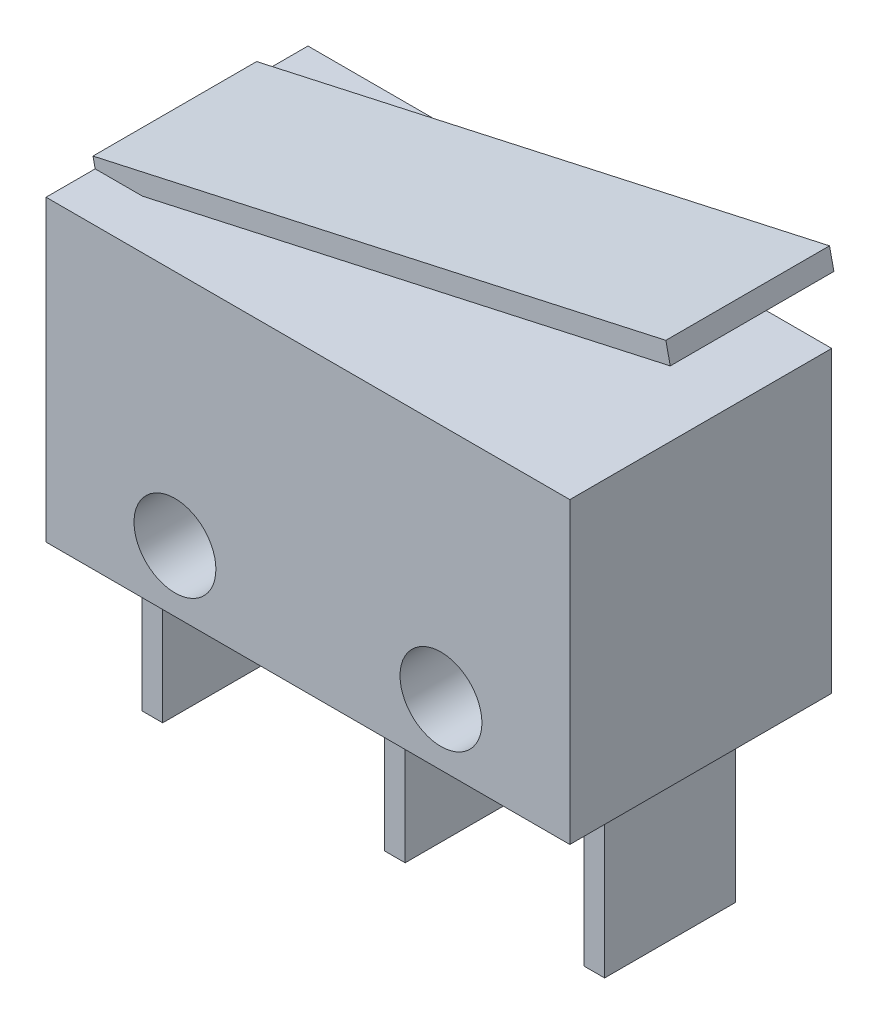
ISO-10303-21;
HEADER;
FILE_DESCRIPTION(('STEP AP214'),'2;1');
FILE_NAME('part.step','',(''),(''),'','','');
FILE_SCHEMA(('AUTOMOTIVE_DESIGN { 1 0 10303 214 1 1 1 1 }'));
ENDSEC;
DATA;
#1=APPLICATION_CONTEXT('core data for automotive mechanical design processes');
#2=APPLICATION_PROTOCOL_DEFINITION('international standard','automotive_design',2000,#1);
#3=PRODUCT_CONTEXT('',#1,'mechanical');
#4=PRODUCT('Part','Part','',(#3));
#5=PRODUCT_RELATED_PRODUCT_CATEGORY('part','',(#4));
#6=PRODUCT_DEFINITION_FORMATION('','',#4);
#7=PRODUCT_DEFINITION_CONTEXT('part definition',#1,'design');
#8=PRODUCT_DEFINITION('design','',#6,#7);
#9=PRODUCT_DEFINITION_SHAPE('','',#8);
#10=(LENGTH_UNIT() NAMED_UNIT(*) SI_UNIT(.MILLI.,.METRE.));
#11=(NAMED_UNIT(*) PLANE_ANGLE_UNIT() SI_UNIT($,.RADIAN.));
#12=(NAMED_UNIT(*) SI_UNIT($,.STERADIAN.) SOLID_ANGLE_UNIT());
#13=UNCERTAINTY_MEASURE_WITH_UNIT(LENGTH_MEASURE(1.E-05),#10,'distance_accuracy_value','');
#14=(GEOMETRIC_REPRESENTATION_CONTEXT(3) GLOBAL_UNCERTAINTY_ASSIGNED_CONTEXT((#13)) GLOBAL_UNIT_ASSIGNED_CONTEXT((#10,
#11,#12)) REPRESENTATION_CONTEXT('',''));
#15=CARTESIAN_POINT('',(0.,0.,0.));
#16=DIRECTION('',(0.,0.,1.));
#17=DIRECTION('',(1.,0.,0.));
#18=AXIS2_PLACEMENT_3D('',#15,#16,#17);
#19=CARTESIAN_POINT('',(-12.8,7.3,3.2));
#20=DIRECTION('',(0.,-1.,0.));
#21=DIRECTION('',(0.,0.,-1.));
#22=AXIS2_PLACEMENT_3D('',#19,#20,#21);
#23=PLANE('',#22);
#24=DIRECTION('',(1.,0.,0.));
#25=VECTOR('',#24,1.);
#26=CARTESIAN_POINT('',(-12.8,7.3,2.));
#27=LINE('',#26,#25);
#28=CARTESIAN_POINT('',(-12.8,7.3,2.));
#29=VERTEX_POINT('',#28);
#30=CARTESIAN_POINT('',(-11.6436203738606,7.3,2.));
#31=VERTEX_POINT('',#30);
#32=EDGE_CURVE('E11',#29,#31,#27,.T.);
#33=ORIENTED_EDGE('',*,*,#32,.F.);
#34=DIRECTION('',(0.,0.,-1.));
#35=VECTOR('',#34,1.);
#36=CARTESIAN_POINT('',(-12.8,7.3,3.2));
#37=LINE('',#36,#35);
#38=CARTESIAN_POINT('',(-12.8,7.3,3.2));
#39=VERTEX_POINT('',#38);
#40=EDGE_CURVE('E340',#39,#29,#37,.T.);
#41=ORIENTED_EDGE('',*,*,#40,.F.);
#42=DIRECTION('',(-1.,0.,0.));
#43=VECTOR('',#42,1.);
#44=CARTESIAN_POINT('',(-12.8,7.3,3.2));
#45=LINE('',#44,#43);
#46=CARTESIAN_POINT('',(0.,7.3,3.2));
#47=VERTEX_POINT('',#46);
#48=EDGE_CURVE('E329',#47,#39,#45,.T.);
#49=ORIENTED_EDGE('',*,*,#48,.F.);
#50=DIRECTION('',(0.,0.,-1.));
#51=VECTOR('',#50,1.);
#52=CARTESIAN_POINT('',(0.,7.3,3.2));
#53=LINE('',#52,#51);
#54=CARTESIAN_POINT('',(0.,7.3,-3.2));
#55=VERTEX_POINT('',#54);
#56=EDGE_CURVE('E343',#47,#55,#53,.T.);
#57=ORIENTED_EDGE('',*,*,#56,.T.);
#58=DIRECTION('',(-1.,0.,0.));
#59=VECTOR('',#58,1.);
#60=CARTESIAN_POINT('',(-12.8,7.3,-3.2));
#61=LINE('',#60,#59);
#62=CARTESIAN_POINT('',(-12.8,7.3,-3.2));
#63=VERTEX_POINT('',#62);
#64=EDGE_CURVE('E325',#55,#63,#61,.T.);
#65=ORIENTED_EDGE('',*,*,#64,.T.);
#66=CARTESIAN_POINT('',(-12.8,7.3,-2.));
#67=VERTEX_POINT('',#66);
#68=EDGE_CURVE('E331',#67,#63,#37,.T.);
#69=ORIENTED_EDGE('',*,*,#68,.F.);
#70=DIRECTION('',(1.,0.,0.));
#71=VECTOR('',#70,1.);
#72=CARTESIAN_POINT('',(-12.8,7.3,-2.));
#73=LINE('',#72,#71);
#74=CARTESIAN_POINT('',(-11.6436203738606,7.3,-2.));
#75=VERTEX_POINT('',#74);
#76=EDGE_CURVE('E353',#67,#75,#73,.T.);
#77=ORIENTED_EDGE('',*,*,#76,.T.);
#78=DIRECTION('',(0.,0.,-1.));
#79=VECTOR('',#78,1.);
#80=CARTESIAN_POINT('',(-11.6436203738606,7.3,3.2));
#81=LINE('',#80,#79);
#82=EDGE_CURVE('E43',#31,#75,#81,.T.);
#83=ORIENTED_EDGE('',*,*,#82,.F.);
#84=EDGE_LOOP('',(#33,#41,#49,#57,#65,#69,#77,#83));
#85=FACE_BOUND('',#84,.T.);
#86=ADVANCED_FACE('F35',(#85),#23,.F.);
#87=CARTESIAN_POINT('',(-12.8,0.,3.2));
#88=DIRECTION('',(0.,1.,0.));
#89=DIRECTION('',(0.,0.,1.));
#90=AXIS2_PLACEMENT_3D('',#87,#88,#89);
#91=PLANE('',#90);
#92=DIRECTION('',(0.,0.,1.));
#93=VECTOR('',#92,1.);
#94=CARTESIAN_POINT('',(-6.12478735657119,0.,1.6));
#95=LINE('',#94,#93);
#96=CARTESIAN_POINT('',(-6.12478735657119,0.,1.6));
#97=VERTEX_POINT('',#96);
#98=CARTESIAN_POINT('',(-6.12478735657119,0.,-1.6));
#99=VERTEX_POINT('',#98);
#100=EDGE_CURVE('E244',#97,#99,#95,.F.);
#101=ORIENTED_EDGE('',*,*,#100,.F.);
#102=DIRECTION('',(1.,0.,0.));
#103=VECTOR('',#102,1.);
#104=CARTESIAN_POINT('',(-6.12478735657119,0.,1.6));
#105=LINE('',#104,#103);
#106=CARTESIAN_POINT('',(-5.62478735657119,0.,1.6));
#107=VERTEX_POINT('',#106);
#108=EDGE_CURVE('E248',#97,#107,#105,.T.);
#109=ORIENTED_EDGE('',*,*,#108,.T.);
#110=DIRECTION('',(0.,0.,1.));
#111=VECTOR('',#110,1.);
#112=CARTESIAN_POINT('',(-5.62478735657119,0.,1.6));
#113=LINE('',#112,#111);
#114=CARTESIAN_POINT('',(-5.62478735657119,0.,-1.6));
#115=VERTEX_POINT('',#114);
#116=EDGE_CURVE('E263',#107,#115,#113,.F.);
#117=ORIENTED_EDGE('',*,*,#116,.T.);
#118=DIRECTION('',(-1.,0.,0.));
#119=VECTOR('',#118,1.);
#120=CARTESIAN_POINT('',(-5.62478735657119,0.,-1.6));
#121=LINE('',#120,#119);
#122=EDGE_CURVE('E260',#115,#99,#121,.T.);
#123=ORIENTED_EDGE('',*,*,#122,.T.);
#124=EDGE_LOOP('',(#101,#109,#117,#123));
#125=FACE_BOUND('',#124,.T.);
#126=DIRECTION('',(1.,0.,0.));
#127=VECTOR('',#126,1.);
#128=CARTESIAN_POINT('',(-12.8,0.,-3.2));
#129=LINE('',#128,#127);
#130=CARTESIAN_POINT('',(-12.8,0.,-3.2));
#131=VERTEX_POINT('',#130);
#132=CARTESIAN_POINT('',(0.,0.,-3.2));
#133=VERTEX_POINT('',#132);
#134=EDGE_CURVE('E334',#131,#133,#129,.T.);
#135=ORIENTED_EDGE('',*,*,#134,.T.);
#136=DIRECTION('',(0.,0.,-1.));
#137=VECTOR('',#136,1.);
#138=CARTESIAN_POINT('',(0.,0.,3.2));
#139=LINE('',#138,#137);
#140=CARTESIAN_POINT('',(0.,0.,3.2));
#141=VERTEX_POINT('',#140);
#142=EDGE_CURVE('E347',#141,#133,#139,.T.);
#143=ORIENTED_EDGE('',*,*,#142,.F.);
#144=DIRECTION('',(1.,0.,0.));
#145=VECTOR('',#144,1.);
#146=CARTESIAN_POINT('',(-12.8,0.,3.2));
#147=LINE('',#146,#145);
#148=CARTESIAN_POINT('',(-12.8,0.,3.2));
#149=VERTEX_POINT('',#148);
#150=EDGE_CURVE('E324',#149,#141,#147,.T.);
#151=ORIENTED_EDGE('',*,*,#150,.F.);
#152=DIRECTION('',(0.,0.,-1.));
#153=VECTOR('',#152,1.);
#154=CARTESIAN_POINT('',(-12.8,0.,3.2));
#155=LINE('',#154,#153);
#156=EDGE_CURVE('E350',#149,#131,#155,.T.);
#157=ORIENTED_EDGE('',*,*,#156,.T.);
#158=EDGE_LOOP('',(#135,#143,#151,#157));
#159=FACE_BOUND('',#158,.T.);
#160=DIRECTION('',(0.,0.,-1.));
#161=VECTOR('',#160,1.);
#162=CARTESIAN_POINT('',(-12.05,0.,1.6));
#163=LINE('',#162,#161);
#164=CARTESIAN_POINT('',(-12.05,0.,1.6));
#165=VERTEX_POINT('',#164);
#166=CARTESIAN_POINT('',(-12.05,0.,-1.6));
#167=VERTEX_POINT('',#166);
#168=EDGE_CURVE('E276',#165,#167,#163,.T.);
#169=ORIENTED_EDGE('',*,*,#168,.F.);
#170=DIRECTION('',(1.,0.,0.));
#171=VECTOR('',#170,1.);
#172=CARTESIAN_POINT('',(-12.05,0.,1.6));
#173=LINE('',#172,#171);
#174=CARTESIAN_POINT('',(-11.55,0.,1.6));
#175=VERTEX_POINT('',#174);
#176=EDGE_CURVE('E280',#165,#175,#173,.T.);
#177=ORIENTED_EDGE('',*,*,#176,.T.);
#178=DIRECTION('',(0.,0.,-1.));
#179=VECTOR('',#178,1.);
#180=CARTESIAN_POINT('',(-11.55,0.,1.6));
#181=LINE('',#180,#179);
#182=CARTESIAN_POINT('',(-11.55,0.,-1.6));
#183=VERTEX_POINT('',#182);
#184=EDGE_CURVE('E295',#175,#183,#181,.T.);
#185=ORIENTED_EDGE('',*,*,#184,.T.);
#186=DIRECTION('',(-1.,0.,0.));
#187=VECTOR('',#186,1.);
#188=CARTESIAN_POINT('',(-11.55,0.,-1.6));
#189=LINE('',#188,#187);
#190=EDGE_CURVE('E292',#183,#167,#189,.T.);
#191=ORIENTED_EDGE('',*,*,#190,.T.);
#192=EDGE_LOOP('',(#169,#177,#185,#191));
#193=FACE_BOUND('',#192,.T.);
#194=DIRECTION('',(0.,0.,-1.));
#195=VECTOR('',#194,1.);
#196=CARTESIAN_POINT('',(-1.25,0.,1.6));
#197=LINE('',#196,#195);
#198=CARTESIAN_POINT('',(-1.25,0.,1.6));
#199=VERTEX_POINT('',#198);
#200=CARTESIAN_POINT('',(-1.25,0.,-1.6));
#201=VERTEX_POINT('',#200);
#202=EDGE_CURVE('E195',#199,#201,#197,.T.);
#203=ORIENTED_EDGE('',*,*,#202,.F.);
#204=DIRECTION('',(1.,0.,0.));
#205=VECTOR('',#204,1.);
#206=CARTESIAN_POINT('',(-1.25,0.,1.6));
#207=LINE('',#206,#205);
#208=CARTESIAN_POINT('',(-0.749999999999997,0.,1.6));
#209=VERTEX_POINT('',#208);
#210=EDGE_CURVE('E219',#199,#209,#207,.T.);
#211=ORIENTED_EDGE('',*,*,#210,.T.);
#212=DIRECTION('',(0.,0.,-1.));
#213=VECTOR('',#212,1.);
#214=CARTESIAN_POINT('',(-0.749999999999997,0.,1.6));
#215=LINE('',#214,#213);
#216=CARTESIAN_POINT('',(-0.749999999999997,0.,-1.6));
#217=VERTEX_POINT('',#216);
#218=EDGE_CURVE('E58',#209,#217,#215,.T.);
#219=ORIENTED_EDGE('',*,*,#218,.T.);
#220=DIRECTION('',(-1.,0.,0.));
#221=VECTOR('',#220,1.);
#222=CARTESIAN_POINT('',(-0.749999999999997,0.,-1.6));
#223=LINE('',#222,#221);
#224=EDGE_CURVE('E231',#217,#201,#223,.T.);
#225=ORIENTED_EDGE('',*,*,#224,.T.);
#226=EDGE_LOOP('',(#203,#211,#219,#225));
#227=FACE_BOUND('',#226,.T.);
#228=ADVANCED_FACE('F385',(#125,#159,#193,#227),#91,.F.);
#229=CARTESIAN_POINT('',(0.,0.,3.2));
#230=DIRECTION('',(0.,0.,-1.));
#231=DIRECTION('',(-1.,0.,0.));
#232=AXIS2_PLACEMENT_3D('',#229,#230,#231);
#233=PLANE('',#232);
#234=DIRECTION('',(0.,-1.,0.));
#235=VECTOR('',#234,1.);
#236=CARTESIAN_POINT('',(-12.8,0.,3.2));
#237=LINE('',#236,#235);
#238=EDGE_CURVE('E321',#39,#149,#237,.T.);
#239=ORIENTED_EDGE('',*,*,#238,.T.);
#240=ORIENTED_EDGE('',*,*,#150,.T.);
#241=DIRECTION('',(0.,1.,0.));
#242=VECTOR('',#241,1.);
#243=CARTESIAN_POINT('',(0.,0.,3.2));
#244=LINE('',#243,#242);
#245=EDGE_CURVE('E327',#141,#47,#244,.T.);
#246=ORIENTED_EDGE('',*,*,#245,.T.);
#247=ORIENTED_EDGE('',*,*,#48,.T.);
#248=EDGE_LOOP('',(#239,#240,#246,#247));
#249=FACE_BOUND('',#248,.T.);
#250=CARTESIAN_POINT('',(-9.65,1.5,3.2));
#251=DIRECTION('',(0.,0.,1.));
#252=DIRECTION('',(1.,0.,0.));
#253=AXIS2_PLACEMENT_3D('',#250,#251,#252);
#254=CIRCLE('',#253,1.);
#255=CARTESIAN_POINT('',(-8.65,1.5,3.2));
#256=VERTEX_POINT('',#255);
#257=EDGE_CURVE('E315',#256,#256,#254,.T.);
#258=ORIENTED_EDGE('',*,*,#257,.F.);
#259=EDGE_LOOP('',(#258));
#260=FACE_BOUND('',#259,.T.);
#261=CARTESIAN_POINT('',(-3.15,1.5,3.2));
#262=DIRECTION('',(0.,0.,1.));
#263=DIRECTION('',(-1.,0.,0.));
#264=AXIS2_PLACEMENT_3D('',#261,#262,#263);
#265=CIRCLE('',#264,1.);
#266=CARTESIAN_POINT('',(-4.15,1.5,3.2));
#267=VERTEX_POINT('',#266);
#268=EDGE_CURVE('E309',#267,#267,#265,.T.);
#269=ORIENTED_EDGE('',*,*,#268,.F.);
#270=EDGE_LOOP('',(#269));
#271=FACE_BOUND('',#270,.T.);
#272=ADVANCED_FACE('F372',(#249,#260,#271),#233,.F.);
#273=CARTESIAN_POINT('',(0.,0.,-3.2));
#274=DIRECTION('',(0.,0.,-1.));
#275=DIRECTION('',(-1.,0.,0.));
#276=AXIS2_PLACEMENT_3D('',#273,#274,#275);
#277=PLANE('',#276);
#278=CARTESIAN_POINT('',(-9.65,1.5,-3.2));
#279=DIRECTION('',(0.,0.,1.));
#280=DIRECTION('',(1.,0.,0.));
#281=AXIS2_PLACEMENT_3D('',#278,#279,#280);
#282=CIRCLE('',#281,1.);
#283=CARTESIAN_POINT('',(-8.65,1.5,-3.2));
#284=VERTEX_POINT('',#283);
#285=EDGE_CURVE('E312',#284,#284,#282,.T.);
#286=ORIENTED_EDGE('',*,*,#285,.T.);
#287=EDGE_LOOP('',(#286));
#288=FACE_BOUND('',#287,.T.);
#289=DIRECTION('',(0.,-1.,0.));
#290=VECTOR('',#289,1.);
#291=CARTESIAN_POINT('',(-12.8,0.,-3.2));
#292=LINE('',#291,#290);
#293=EDGE_CURVE('E318',#63,#131,#292,.T.);
#294=ORIENTED_EDGE('',*,*,#293,.F.);
#295=ORIENTED_EDGE('',*,*,#64,.F.);
#296=DIRECTION('',(0.,1.,0.));
#297=VECTOR('',#296,1.);
#298=CARTESIAN_POINT('',(0.,0.,-3.2));
#299=LINE('',#298,#297);
#300=EDGE_CURVE('E336',#133,#55,#299,.T.);
#301=ORIENTED_EDGE('',*,*,#300,.F.);
#302=ORIENTED_EDGE('',*,*,#134,.F.);
#303=EDGE_LOOP('',(#294,#295,#301,#302));
#304=FACE_BOUND('',#303,.T.);
#305=CARTESIAN_POINT('',(-3.15,1.5,-3.2));
#306=DIRECTION('',(0.,0.,1.));
#307=DIRECTION('',(-1.,0.,0.));
#308=AXIS2_PLACEMENT_3D('',#305,#306,#307);
#309=CIRCLE('',#308,1.);
#310=CARTESIAN_POINT('',(-4.15,1.5,-3.2));
#311=VERTEX_POINT('',#310);
#312=EDGE_CURVE('E308',#311,#311,#309,.T.);
#313=ORIENTED_EDGE('',*,*,#312,.T.);
#314=EDGE_LOOP('',(#313));
#315=FACE_BOUND('',#314,.T.);
#316=ADVANCED_FACE('F382',(#288,#304,#315),#277,.T.);
#317=CARTESIAN_POINT('',(-12.8,0.,3.2));
#318=DIRECTION('',(1.,0.,0.));
#319=DIRECTION('',(0.,0.,-1.));
#320=AXIS2_PLACEMENT_3D('',#317,#318,#319);
#321=PLANE('',#320);
#322=ORIENTED_EDGE('',*,*,#293,.T.);
#323=ORIENTED_EDGE('',*,*,#156,.F.);
#324=ORIENTED_EDGE('',*,*,#238,.F.);
#325=ORIENTED_EDGE('',*,*,#40,.T.);
#326=EDGE_CURVE('E344',#29,#67,#37,.T.);
#327=ORIENTED_EDGE('',*,*,#326,.T.);
#328=ORIENTED_EDGE('',*,*,#68,.T.);
#329=EDGE_LOOP('',(#322,#323,#324,#325,#327,#328));
#330=FACE_BOUND('',#329,.T.);
#331=ADVANCED_FACE('F37',(#330),#321,.F.);
#332=CARTESIAN_POINT('',(0.,0.,3.2));
#333=DIRECTION('',(-1.,0.,0.));
#334=DIRECTION('',(0.,0.,1.));
#335=AXIS2_PLACEMENT_3D('',#332,#333,#334);
#336=PLANE('',#335);
#337=ORIENTED_EDGE('',*,*,#300,.T.);
#338=ORIENTED_EDGE('',*,*,#56,.F.);
#339=ORIENTED_EDGE('',*,*,#245,.F.);
#340=ORIENTED_EDGE('',*,*,#142,.T.);
#341=EDGE_LOOP('',(#337,#338,#339,#340));
#342=FACE_BOUND('',#341,.T.);
#343=ADVANCED_FACE('F387',(#342),#336,.F.);
#344=CARTESIAN_POINT('',(-9.65,1.5,3.2));
#345=DIRECTION('',(0.,0.,-1.));
#346=DIRECTION('',(-1.,0.,0.));
#347=AXIS2_PLACEMENT_3D('',#344,#345,#346);
#348=CYLINDRICAL_SURFACE('',#347,1.);
#349=ORIENTED_EDGE('',*,*,#257,.T.);
#350=EDGE_LOOP('',(#349));
#351=FACE_BOUND('',#350,.T.);
#352=ORIENTED_EDGE('',*,*,#285,.F.);
#353=EDGE_LOOP('',(#352));
#354=FACE_BOUND('',#353,.T.);
#355=ADVANCED_FACE('F389',(#351,#354),#348,.F.);
#356=CARTESIAN_POINT('',(-3.15,1.5,3.2));
#357=DIRECTION('',(0.,0.,-1.));
#358=DIRECTION('',(-1.,0.,0.));
#359=AXIS2_PLACEMENT_3D('',#356,#357,#358);
#360=CYLINDRICAL_SURFACE('',#359,1.);
#361=ORIENTED_EDGE('',*,*,#268,.T.);
#362=EDGE_LOOP('',(#361));
#363=FACE_BOUND('',#362,.T.);
#364=ORIENTED_EDGE('',*,*,#312,.F.);
#365=EDGE_LOOP('',(#364));
#366=FACE_BOUND('',#365,.T.);
#367=ADVANCED_FACE('F395',(#363,#366),#360,.F.);
#368=CARTESIAN_POINT('',(-12.05,-4.,1.6));
#369=DIRECTION('',(1.,0.,0.));
#370=DIRECTION('',(0.,0.,-1.));
#371=AXIS2_PLACEMENT_3D('',#368,#369,#370);
#372=PLANE('',#371);
#373=ORIENTED_EDGE('',*,*,#168,.T.);
#374=DIRECTION('',(0.,1.,0.));
#375=VECTOR('',#374,1.);
#376=CARTESIAN_POINT('',(-12.05,-4.,-1.6));
#377=LINE('',#376,#375);
#378=CARTESIAN_POINT('',(-12.05,-4.,-1.6));
#379=VERTEX_POINT('',#378);
#380=EDGE_CURVE('E306',#379,#167,#377,.T.);
#381=ORIENTED_EDGE('',*,*,#380,.F.);
#382=DIRECTION('',(0.,0.,-1.));
#383=VECTOR('',#382,1.);
#384=CARTESIAN_POINT('',(-12.05,-4.,1.6));
#385=LINE('',#384,#383);
#386=CARTESIAN_POINT('',(-12.05,-4.,1.6));
#387=VERTEX_POINT('',#386);
#388=EDGE_CURVE('E277',#387,#379,#385,.T.);
#389=ORIENTED_EDGE('',*,*,#388,.F.);
#390=DIRECTION('',(0.,1.,0.));
#391=VECTOR('',#390,1.);
#392=CARTESIAN_POINT('',(-12.05,-4.,1.6));
#393=LINE('',#392,#391);
#394=EDGE_CURVE('E289',#387,#165,#393,.T.);
#395=ORIENTED_EDGE('',*,*,#394,.T.);
#396=EDGE_LOOP('',(#373,#381,#389,#395));
#397=FACE_BOUND('',#396,.T.);
#398=ADVANCED_FACE('F412',(#397),#372,.F.);
#399=CARTESIAN_POINT('',(-11.55,-4.,-1.6));
#400=DIRECTION('',(0.,0.,-1.));
#401=DIRECTION('',(-1.,0.,0.));
#402=AXIS2_PLACEMENT_3D('',#399,#400,#401);
#403=PLANE('',#402);
#404=ORIENTED_EDGE('',*,*,#190,.F.);
#405=DIRECTION('',(0.,1.,0.));
#406=VECTOR('',#405,1.);
#407=CARTESIAN_POINT('',(-11.55,-4.,-1.6));
#408=LINE('',#407,#406);
#409=CARTESIAN_POINT('',(-11.55,-4.,-1.6));
#410=VERTEX_POINT('',#409);
#411=EDGE_CURVE('E304',#410,#183,#408,.T.);
#412=ORIENTED_EDGE('',*,*,#411,.F.);
#413=DIRECTION('',(-1.,0.,0.));
#414=VECTOR('',#413,1.);
#415=CARTESIAN_POINT('',(-11.55,-4.,-1.6));
#416=LINE('',#415,#414);
#417=EDGE_CURVE('E279',#410,#379,#416,.T.);
#418=ORIENTED_EDGE('',*,*,#417,.T.);
#419=ORIENTED_EDGE('',*,*,#380,.T.);
#420=EDGE_LOOP('',(#404,#412,#418,#419));
#421=FACE_BOUND('',#420,.T.);
#422=ADVANCED_FACE('F416',(#421),#403,.T.);
#423=CARTESIAN_POINT('',(-11.55,-4.,1.6));
#424=DIRECTION('',(1.,0.,0.));
#425=DIRECTION('',(0.,0.,-1.));
#426=AXIS2_PLACEMENT_3D('',#423,#424,#425);
#427=PLANE('',#426);
#428=ORIENTED_EDGE('',*,*,#184,.F.);
#429=DIRECTION('',(0.,1.,0.));
#430=VECTOR('',#429,1.);
#431=CARTESIAN_POINT('',(-11.55,-4.,1.6));
#432=LINE('',#431,#430);
#433=CARTESIAN_POINT('',(-11.55,-4.,1.6));
#434=VERTEX_POINT('',#433);
#435=EDGE_CURVE('E301',#434,#175,#432,.T.);
#436=ORIENTED_EDGE('',*,*,#435,.F.);
#437=DIRECTION('',(0.,0.,-1.));
#438=VECTOR('',#437,1.);
#439=CARTESIAN_POINT('',(-11.55,-4.,1.6));
#440=LINE('',#439,#438);
#441=EDGE_CURVE('E283',#434,#410,#440,.T.);
#442=ORIENTED_EDGE('',*,*,#441,.T.);
#443=ORIENTED_EDGE('',*,*,#411,.T.);
#444=EDGE_LOOP('',(#428,#436,#442,#443));
#445=FACE_BOUND('',#444,.T.);
#446=ADVANCED_FACE('F420',(#445),#427,.T.);
#447=CARTESIAN_POINT('',(-12.05,-4.,1.6));
#448=DIRECTION('',(0.,0.,1.));
#449=DIRECTION('',(1.,0.,0.));
#450=AXIS2_PLACEMENT_3D('',#447,#448,#449);
#451=PLANE('',#450);
#452=ORIENTED_EDGE('',*,*,#176,.F.);
#453=ORIENTED_EDGE('',*,*,#394,.F.);
#454=DIRECTION('',(1.,0.,0.));
#455=VECTOR('',#454,1.);
#456=CARTESIAN_POINT('',(-12.05,-4.,1.6));
#457=LINE('',#456,#455);
#458=EDGE_CURVE('E286',#387,#434,#457,.T.);
#459=ORIENTED_EDGE('',*,*,#458,.T.);
#460=ORIENTED_EDGE('',*,*,#435,.T.);
#461=EDGE_LOOP('',(#452,#453,#459,#460));
#462=FACE_BOUND('',#461,.T.);
#463=ADVANCED_FACE('F424',(#462),#451,.T.);
#464=CARTESIAN_POINT('',(0.,-4.,0.));
#465=DIRECTION('',(0.,1.,0.));
#466=DIRECTION('',(-1.,0.,0.));
#467=AXIS2_PLACEMENT_3D('',#464,#465,#466);
#468=PLANE('',#467);
#469=ORIENTED_EDGE('',*,*,#388,.T.);
#470=ORIENTED_EDGE('',*,*,#417,.F.);
#471=ORIENTED_EDGE('',*,*,#441,.F.);
#472=ORIENTED_EDGE('',*,*,#458,.F.);
#473=EDGE_LOOP('',(#469,#470,#471,#472));
#474=FACE_BOUND('',#473,.T.);
#475=ADVANCED_FACE('F428',(#474),#468,.F.);
#476=CARTESIAN_POINT('',(-6.12478735657119,-4.,1.6));
#477=DIRECTION('',(1.,0.,0.));
#478=DIRECTION('',(0.,0.,-1.));
#479=AXIS2_PLACEMENT_3D('',#476,#477,#478);
#480=PLANE('',#479);
#481=ORIENTED_EDGE('',*,*,#100,.T.);
#482=DIRECTION('',(0.,1.,0.));
#483=VECTOR('',#482,1.);
#484=CARTESIAN_POINT('',(-6.12478735657119,-4.,-1.6));
#485=LINE('',#484,#483);
#486=CARTESIAN_POINT('',(-6.12478735657119,-4.,-1.6));
#487=VERTEX_POINT('',#486);
#488=EDGE_CURVE('E274',#487,#99,#485,.T.);
#489=ORIENTED_EDGE('',*,*,#488,.F.);
#490=DIRECTION('',(0.,0.,1.));
#491=VECTOR('',#490,1.);
#492=CARTESIAN_POINT('',(-6.12478735657119,-4.,1.6));
#493=LINE('',#492,#491);
#494=CARTESIAN_POINT('',(-6.12478735657119,-4.,1.6));
#495=VERTEX_POINT('',#494);
#496=EDGE_CURVE('E245',#495,#487,#493,.F.);
#497=ORIENTED_EDGE('',*,*,#496,.F.);
#498=DIRECTION('',(0.,1.,0.));
#499=VECTOR('',#498,1.);
#500=CARTESIAN_POINT('',(-6.12478735657119,-4.,1.6));
#501=LINE('',#500,#499);
#502=EDGE_CURVE('E257',#495,#97,#501,.T.);
#503=ORIENTED_EDGE('',*,*,#502,.T.);
#504=EDGE_LOOP('',(#481,#489,#497,#503));
#505=FACE_BOUND('',#504,.T.);
#506=ADVANCED_FACE('F432',(#505),#480,.F.);
#507=CARTESIAN_POINT('',(-5.62478735657119,-4.,-1.6));
#508=DIRECTION('',(0.,0.,-1.));
#509=DIRECTION('',(-1.,0.,0.));
#510=AXIS2_PLACEMENT_3D('',#507,#508,#509);
#511=PLANE('',#510);
#512=ORIENTED_EDGE('',*,*,#122,.F.);
#513=DIRECTION('',(0.,1.,0.));
#514=VECTOR('',#513,1.);
#515=CARTESIAN_POINT('',(-5.62478735657119,-4.,-1.6));
#516=LINE('',#515,#514);
#517=CARTESIAN_POINT('',(-5.62478735657119,-4.,-1.6));
#518=VERTEX_POINT('',#517);
#519=EDGE_CURVE('E272',#518,#115,#516,.T.);
#520=ORIENTED_EDGE('',*,*,#519,.F.);
#521=DIRECTION('',(-1.,0.,0.));
#522=VECTOR('',#521,1.);
#523=CARTESIAN_POINT('',(-5.62478735657119,-4.,-1.6));
#524=LINE('',#523,#522);
#525=EDGE_CURVE('E247',#518,#487,#524,.T.);
#526=ORIENTED_EDGE('',*,*,#525,.T.);
#527=ORIENTED_EDGE('',*,*,#488,.T.);
#528=EDGE_LOOP('',(#512,#520,#526,#527));
#529=FACE_BOUND('',#528,.T.);
#530=ADVANCED_FACE('F436',(#529),#511,.T.);
#531=CARTESIAN_POINT('',(-5.62478735657119,-4.,1.6));
#532=DIRECTION('',(1.,0.,0.));
#533=DIRECTION('',(0.,0.,-1.));
#534=AXIS2_PLACEMENT_3D('',#531,#532,#533);
#535=PLANE('',#534);
#536=ORIENTED_EDGE('',*,*,#116,.F.);
#537=DIRECTION('',(0.,1.,0.));
#538=VECTOR('',#537,1.);
#539=CARTESIAN_POINT('',(-5.62478735657119,-4.,1.6));
#540=LINE('',#539,#538);
#541=CARTESIAN_POINT('',(-5.62478735657119,-4.,1.6));
#542=VERTEX_POINT('',#541);
#543=EDGE_CURVE('E269',#542,#107,#540,.T.);
#544=ORIENTED_EDGE('',*,*,#543,.F.);
#545=DIRECTION('',(0.,0.,1.));
#546=VECTOR('',#545,1.);
#547=CARTESIAN_POINT('',(-5.62478735657119,-4.,1.6));
#548=LINE('',#547,#546);
#549=EDGE_CURVE('E251',#542,#518,#548,.F.);
#550=ORIENTED_EDGE('',*,*,#549,.T.);
#551=ORIENTED_EDGE('',*,*,#519,.T.);
#552=EDGE_LOOP('',(#536,#544,#550,#551));
#553=FACE_BOUND('',#552,.T.);
#554=ADVANCED_FACE('F440',(#553),#535,.T.);
#555=CARTESIAN_POINT('',(-6.12478735657119,-4.,1.6));
#556=DIRECTION('',(0.,0.,1.));
#557=DIRECTION('',(1.,0.,0.));
#558=AXIS2_PLACEMENT_3D('',#555,#556,#557);
#559=PLANE('',#558);
#560=ORIENTED_EDGE('',*,*,#108,.F.);
#561=ORIENTED_EDGE('',*,*,#502,.F.);
#562=DIRECTION('',(1.,0.,0.));
#563=VECTOR('',#562,1.);
#564=CARTESIAN_POINT('',(-6.12478735657119,-4.,1.6));
#565=LINE('',#564,#563);
#566=EDGE_CURVE('E254',#495,#542,#565,.T.);
#567=ORIENTED_EDGE('',*,*,#566,.T.);
#568=ORIENTED_EDGE('',*,*,#543,.T.);
#569=EDGE_LOOP('',(#560,#561,#567,#568));
#570=FACE_BOUND('',#569,.T.);
#571=ADVANCED_FACE('F444',(#570),#559,.T.);
#572=CARTESIAN_POINT('',(0.,-4.,0.));
#573=DIRECTION('',(0.,-1.,0.));
#574=DIRECTION('',(1.,0.,0.));
#575=AXIS2_PLACEMENT_3D('',#572,#573,#574);
#576=PLANE('',#575);
#577=ORIENTED_EDGE('',*,*,#496,.T.);
#578=ORIENTED_EDGE('',*,*,#525,.F.);
#579=ORIENTED_EDGE('',*,*,#549,.F.);
#580=ORIENTED_EDGE('',*,*,#566,.F.);
#581=EDGE_LOOP('',(#577,#578,#579,#580));
#582=FACE_BOUND('',#581,.T.);
#583=ADVANCED_FACE('F448',(#582),#576,.T.);
#584=CARTESIAN_POINT('',(-1.25,-4.,1.6));
#585=DIRECTION('',(1.,0.,0.));
#586=DIRECTION('',(0.,0.,-1.));
#587=AXIS2_PLACEMENT_3D('',#584,#585,#586);
#588=PLANE('',#587);
#589=ORIENTED_EDGE('',*,*,#202,.T.);
#590=DIRECTION('',(0.,1.,0.));
#591=VECTOR('',#590,1.);
#592=CARTESIAN_POINT('',(-1.25,-4.,-1.6));
#593=LINE('',#592,#591);
#594=CARTESIAN_POINT('',(-1.25,-4.,-1.6));
#595=VERTEX_POINT('',#594);
#596=EDGE_CURVE('E242',#595,#201,#593,.T.);
#597=ORIENTED_EDGE('',*,*,#596,.F.);
#598=DIRECTION('',(0.,0.,-1.));
#599=VECTOR('',#598,1.);
#600=CARTESIAN_POINT('',(-1.25,-4.,1.6));
#601=LINE('',#600,#599);
#602=CARTESIAN_POINT('',(-1.25,-4.,1.6));
#603=VERTEX_POINT('',#602);
#604=EDGE_CURVE('E216',#603,#595,#601,.T.);
#605=ORIENTED_EDGE('',*,*,#604,.F.);
#606=DIRECTION('',(0.,1.,0.));
#607=VECTOR('',#606,1.);
#608=CARTESIAN_POINT('',(-1.25,-4.,1.6));
#609=LINE('',#608,#607);
#610=EDGE_CURVE('E228',#603,#199,#609,.T.);
#611=ORIENTED_EDGE('',*,*,#610,.T.);
#612=EDGE_LOOP('',(#589,#597,#605,#611));
#613=FACE_BOUND('',#612,.T.);
#614=ADVANCED_FACE('F452',(#613),#588,.F.);
#615=CARTESIAN_POINT('',(-0.749999999999997,-4.,-1.6));
#616=DIRECTION('',(0.,0.,-1.));
#617=DIRECTION('',(-1.,0.,0.));
#618=AXIS2_PLACEMENT_3D('',#615,#616,#617);
#619=PLANE('',#618);
#620=ORIENTED_EDGE('',*,*,#224,.F.);
#621=DIRECTION('',(0.,1.,0.));
#622=VECTOR('',#621,1.);
#623=CARTESIAN_POINT('',(-0.749999999999997,-4.,-1.6));
#624=LINE('',#623,#622);
#625=CARTESIAN_POINT('',(-0.749999999999997,-4.,-1.6));
#626=VERTEX_POINT('',#625);
#627=EDGE_CURVE('E240',#626,#217,#624,.T.);
#628=ORIENTED_EDGE('',*,*,#627,.F.);
#629=DIRECTION('',(-1.,0.,0.));
#630=VECTOR('',#629,1.);
#631=CARTESIAN_POINT('',(-0.749999999999997,-4.,-1.6));
#632=LINE('',#631,#630);
#633=EDGE_CURVE('E218',#626,#595,#632,.T.);
#634=ORIENTED_EDGE('',*,*,#633,.T.);
#635=ORIENTED_EDGE('',*,*,#596,.T.);
#636=EDGE_LOOP('',(#620,#628,#634,#635));
#637=FACE_BOUND('',#636,.T.);
#638=ADVANCED_FACE('F456',(#637),#619,.T.);
#639=CARTESIAN_POINT('',(-0.749999999999997,-4.,1.6));
#640=DIRECTION('',(1.,0.,0.));
#641=DIRECTION('',(0.,0.,-1.));
#642=AXIS2_PLACEMENT_3D('',#639,#640,#641);
#643=PLANE('',#642);
#644=ORIENTED_EDGE('',*,*,#218,.F.);
#645=DIRECTION('',(0.,1.,0.));
#646=VECTOR('',#645,1.);
#647=CARTESIAN_POINT('',(-0.749999999999997,-4.,1.6));
#648=LINE('',#647,#646);
#649=CARTESIAN_POINT('',(-0.749999999999997,-4.,1.6));
#650=VERTEX_POINT('',#649);
#651=EDGE_CURVE('E238',#650,#209,#648,.T.);
#652=ORIENTED_EDGE('',*,*,#651,.F.);
#653=DIRECTION('',(0.,0.,-1.));
#654=VECTOR('',#653,1.);
#655=CARTESIAN_POINT('',(-0.749999999999997,-4.,1.6));
#656=LINE('',#655,#654);
#657=EDGE_CURVE('E222',#650,#626,#656,.T.);
#658=ORIENTED_EDGE('',*,*,#657,.T.);
#659=ORIENTED_EDGE('',*,*,#627,.T.);
#660=EDGE_LOOP('',(#644,#652,#658,#659));
#661=FACE_BOUND('',#660,.T.);
#662=ADVANCED_FACE('F460',(#661),#643,.T.);
#663=CARTESIAN_POINT('',(-1.25,-4.,1.6));
#664=DIRECTION('',(0.,0.,1.));
#665=DIRECTION('',(1.,0.,0.));
#666=AXIS2_PLACEMENT_3D('',#663,#664,#665);
#667=PLANE('',#666);
#668=ORIENTED_EDGE('',*,*,#210,.F.);
#669=ORIENTED_EDGE('',*,*,#610,.F.);
#670=DIRECTION('',(1.,0.,0.));
#671=VECTOR('',#670,1.);
#672=CARTESIAN_POINT('',(-1.25,-4.,1.6));
#673=LINE('',#672,#671);
#674=EDGE_CURVE('E225',#603,#650,#673,.T.);
#675=ORIENTED_EDGE('',*,*,#674,.T.);
#676=ORIENTED_EDGE('',*,*,#651,.T.);
#677=EDGE_LOOP('',(#668,#669,#675,#676));
#678=FACE_BOUND('',#677,.T.);
#679=ADVANCED_FACE('F464',(#678),#667,.T.);
#680=CARTESIAN_POINT('',(0.,-4.,0.));
#681=DIRECTION('',(0.,1.,0.));
#682=DIRECTION('',(-1.,0.,0.));
#683=AXIS2_PLACEMENT_3D('',#680,#681,#682);
#684=PLANE('',#683);
#685=ORIENTED_EDGE('',*,*,#604,.T.);
#686=ORIENTED_EDGE('',*,*,#633,.F.);
#687=ORIENTED_EDGE('',*,*,#657,.F.);
#688=ORIENTED_EDGE('',*,*,#674,.F.);
#689=EDGE_LOOP('',(#685,#686,#687,#688));
#690=FACE_BOUND('',#689,.T.);
#691=ADVANCED_FACE('F467',(#690),#684,.F.);
#692=CARTESIAN_POINT('',(-12.7459520052176,7.05591228162809,2.));
#693=DIRECTION('',(-0.21619197912941,0.976350873487656,0.));
#694=DIRECTION('',(-0.976350873487656,-0.21619197912941,0.));
#695=AXIS2_PLACEMENT_3D('',#692,#693,#694);
#696=PLANE('',#695);
#697=DIRECTION('',(0.976350873487656,0.21619197912941,0.));
#698=VECTOR('',#697,1.);
#699=CARTESIAN_POINT('',(-12.7459520052176,7.05591228162809,2.));
#700=LINE('',#699,#698);
#701=CARTESIAN_POINT('',(1.25404799478235,10.1559122816281,2.));
#702=VERTEX_POINT('',#701);
#703=EDGE_CURVE('E177',#31,#702,#700,.T.);
#704=ORIENTED_EDGE('',*,*,#703,.F.);
#705=ORIENTED_EDGE('',*,*,#82,.T.);
#706=DIRECTION('',(0.976350873487656,0.21619197912941,0.));
#707=VECTOR('',#706,1.);
#708=CARTESIAN_POINT('',(-12.7459520052176,7.05591228162809,-2.));
#709=LINE('',#708,#707);
#710=CARTESIAN_POINT('',(1.25404799478235,10.1559122816281,-2.));
#711=VERTEX_POINT('',#710);
#712=EDGE_CURVE('E50',#75,#711,#709,.T.);
#713=ORIENTED_EDGE('',*,*,#712,.T.);
#714=DIRECTION('',(0.,0.,-1.));
#715=VECTOR('',#714,1.);
#716=CARTESIAN_POINT('',(1.25404799478235,10.1559122816281,2.));
#717=LINE('',#716,#715);
#718=EDGE_CURVE('E191',#702,#711,#717,.T.);
#719=ORIENTED_EDGE('',*,*,#718,.F.);
#720=EDGE_LOOP('',(#704,#705,#713,#719));
#721=FACE_BOUND('',#720,.T.);
#722=ADVANCED_FACE('F192',(#721),#696,.F.);
#723=CARTESIAN_POINT('',(-12.7459520052176,7.05591228162809,2.));
#724=DIRECTION('',(-0.976350873487656,-0.216191979129407,0.));
#725=DIRECTION('',(0.216191979129407,-0.976350873487656,0.));
#726=AXIS2_PLACEMENT_3D('',#723,#724,#725);
#727=PLANE('',#726);
#728=ORIENTED_EDGE('',*,*,#326,.F.);
#729=DIRECTION('',(-0.216191979129407,0.976350873487656,0.));
#730=VECTOR('',#729,1.);
#731=CARTESIAN_POINT('',(-12.7459520052176,7.05591228162809,2.));
#732=LINE('',#731,#730);
#733=CARTESIAN_POINT('',(-12.8540479947824,7.54408771837191,2.));
#734=VERTEX_POINT('',#733);
#735=EDGE_CURVE('E201',#29,#734,#732,.T.);
#736=ORIENTED_EDGE('',*,*,#735,.T.);
#737=DIRECTION('',(0.,0.,-1.));
#738=VECTOR('',#737,1.);
#739=CARTESIAN_POINT('',(-12.8540479947824,7.54408771837191,2.));
#740=LINE('',#739,#738);
#741=CARTESIAN_POINT('',(-12.8540479947824,7.54408771837191,-2.));
#742=VERTEX_POINT('',#741);
#743=EDGE_CURVE('E205',#734,#742,#740,.T.);
#744=ORIENTED_EDGE('',*,*,#743,.T.);
#745=DIRECTION('',(-0.216191979129407,0.976350873487656,0.));
#746=VECTOR('',#745,1.);
#747=CARTESIAN_POINT('',(-12.7459520052176,7.05591228162809,-2.));
#748=LINE('',#747,#746);
#749=EDGE_CURVE('E188',#67,#742,#748,.T.);
#750=ORIENTED_EDGE('',*,*,#749,.F.);
#751=EDGE_LOOP('',(#728,#736,#744,#750));
#752=FACE_BOUND('',#751,.T.);
#753=ADVANCED_FACE('F361',(#752),#727,.T.);
#754=CARTESIAN_POINT('',(0.,0.,2.));
#755=DIRECTION('',(0.,0.,-1.));
#756=DIRECTION('',(-1.,0.,0.));
#757=AXIS2_PLACEMENT_3D('',#754,#755,#756);
#758=PLANE('',#757);
#759=ORIENTED_EDGE('',*,*,#735,.F.);
#760=ORIENTED_EDGE('',*,*,#32,.T.);
#761=ORIENTED_EDGE('',*,*,#703,.T.);
#762=DIRECTION('',(0.216191979129407,-0.976350873487656,0.));
#763=VECTOR('',#762,1.);
#764=CARTESIAN_POINT('',(1.14595200521765,10.6440877183719,2.));
#765=LINE('',#764,#763);
#766=CARTESIAN_POINT('',(1.14595200521765,10.6440877183719,2.));
#767=VERTEX_POINT('',#766);
#768=EDGE_CURVE('E183',#767,#702,#765,.T.);
#769=ORIENTED_EDGE('',*,*,#768,.F.);
#770=DIRECTION('',(0.976350873487656,0.21619197912941,0.));
#771=VECTOR('',#770,1.);
#772=CARTESIAN_POINT('',(-12.8540479947824,7.54408771837191,2.));
#773=LINE('',#772,#771);
#774=EDGE_CURVE('E199',#734,#767,#773,.T.);
#775=ORIENTED_EDGE('',*,*,#774,.F.);
#776=EDGE_LOOP('',(#759,#760,#761,#769,#775));
#777=FACE_BOUND('',#776,.T.);
#778=ADVANCED_FACE('F180',(#777),#758,.F.);
#779=CARTESIAN_POINT('',(0.,0.,-2.));
#780=DIRECTION('',(0.,0.,-1.));
#781=DIRECTION('',(-1.,0.,0.));
#782=AXIS2_PLACEMENT_3D('',#779,#780,#781);
#783=PLANE('',#782);
#784=ORIENTED_EDGE('',*,*,#76,.F.);
#785=ORIENTED_EDGE('',*,*,#749,.T.);
#786=DIRECTION('',(0.976350873487656,0.21619197912941,0.));
#787=VECTOR('',#786,1.);
#788=CARTESIAN_POINT('',(-12.8540479947824,7.54408771837191,-2.));
#789=LINE('',#788,#787);
#790=CARTESIAN_POINT('',(1.14595200521765,10.6440877183719,-2.));
#791=VERTEX_POINT('',#790);
#792=EDGE_CURVE('E209',#742,#791,#789,.T.);
#793=ORIENTED_EDGE('',*,*,#792,.T.);
#794=DIRECTION('',(0.216191979129407,-0.976350873487656,0.));
#795=VECTOR('',#794,1.);
#796=CARTESIAN_POINT('',(1.14595200521765,10.6440877183719,-2.));
#797=LINE('',#796,#795);
#798=EDGE_CURVE('E207',#791,#711,#797,.T.);
#799=ORIENTED_EDGE('',*,*,#798,.T.);
#800=ORIENTED_EDGE('',*,*,#712,.F.);
#801=EDGE_LOOP('',(#784,#785,#793,#799,#800));
#802=FACE_BOUND('',#801,.T.);
#803=ADVANCED_FACE('F359',(#802),#783,.T.);
#804=CARTESIAN_POINT('',(1.14595200521765,10.6440877183719,2.));
#805=DIRECTION('',(0.976350873487657,0.216191979129407,0.));
#806=DIRECTION('',(-0.216191979129407,0.976350873487657,0.));
#807=AXIS2_PLACEMENT_3D('',#804,#805,#806);
#808=PLANE('',#807);
#809=ORIENTED_EDGE('',*,*,#798,.F.);
#810=DIRECTION('',(0.,0.,-1.));
#811=VECTOR('',#810,1.);
#812=CARTESIAN_POINT('',(1.14595200521765,10.6440877183719,2.));
#813=LINE('',#812,#811);
#814=EDGE_CURVE('E196',#767,#791,#813,.T.);
#815=ORIENTED_EDGE('',*,*,#814,.F.);
#816=ORIENTED_EDGE('',*,*,#768,.T.);
#817=ORIENTED_EDGE('',*,*,#718,.T.);
#818=EDGE_LOOP('',(#809,#815,#816,#817));
#819=FACE_BOUND('',#818,.T.);
#820=ADVANCED_FACE('F198',(#819),#808,.T.);
#821=CARTESIAN_POINT('',(-12.8540479947824,7.54408771837191,2.));
#822=DIRECTION('',(-0.21619197912941,0.976350873487656,0.));
#823=DIRECTION('',(-0.976350873487656,-0.21619197912941,0.));
#824=AXIS2_PLACEMENT_3D('',#821,#822,#823);
#825=PLANE('',#824);
#826=ORIENTED_EDGE('',*,*,#792,.F.);
#827=ORIENTED_EDGE('',*,*,#743,.F.);
#828=ORIENTED_EDGE('',*,*,#774,.T.);
#829=ORIENTED_EDGE('',*,*,#814,.T.);
#830=EDGE_LOOP('',(#826,#827,#828,#829));
#831=FACE_BOUND('',#830,.T.);
#832=ADVANCED_FACE('F365',(#831),#825,.T.);
#833=CLOSED_SHELL('',(#86,#228,#272,#316,#331,#343,#355,#367,#398,#422,#446,#463,#475,#506,#530,
#554,#571,#583,#614,#638,#662,#679,#691,#722,#753,#778,#803,#820,#832));
#834=MANIFOLD_SOLID_BREP('B2',#833);
#835=ADVANCED_BREP_SHAPE_REPRESENTATION('',(#18,#834),#14);
#836=SHAPE_DEFINITION_REPRESENTATION(#9,#835);
ENDSEC;
END-ISO-10303-21;
